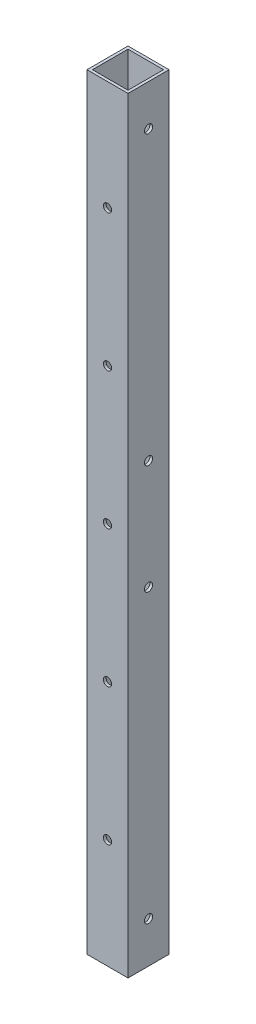
ISO-10303-21;
HEADER;
FILE_DESCRIPTION(('STEP AP214'),'2;1');
FILE_NAME('part.step','',(''),(''),'','','');
FILE_SCHEMA(('AUTOMOTIVE_DESIGN { 1 0 10303 214 1 1 1 1 }'));
ENDSEC;
DATA;
#1=APPLICATION_CONTEXT('core data for automotive mechanical design processes');
#2=APPLICATION_PROTOCOL_DEFINITION('international standard','automotive_design',2000,#1);
#3=PRODUCT_CONTEXT('',#1,'mechanical');
#4=PRODUCT('Part','Part','',(#3));
#5=PRODUCT_RELATED_PRODUCT_CATEGORY('part','',(#4));
#6=PRODUCT_DEFINITION_FORMATION('','',#4);
#7=PRODUCT_DEFINITION_CONTEXT('part definition',#1,'design');
#8=PRODUCT_DEFINITION('design','',#6,#7);
#9=PRODUCT_DEFINITION_SHAPE('','',#8);
#10=(LENGTH_UNIT() NAMED_UNIT(*) SI_UNIT(.MILLI.,.METRE.));
#11=(NAMED_UNIT(*) PLANE_ANGLE_UNIT() SI_UNIT($,.RADIAN.));
#12=(NAMED_UNIT(*) SI_UNIT($,.STERADIAN.) SOLID_ANGLE_UNIT());
#13=UNCERTAINTY_MEASURE_WITH_UNIT(LENGTH_MEASURE(1.E-05),#10,'distance_accuracy_value','');
#14=(GEOMETRIC_REPRESENTATION_CONTEXT(3) GLOBAL_UNCERTAINTY_ASSIGNED_CONTEXT((#13)) GLOBAL_UNIT_ASSIGNED_CONTEXT((#10,
#11,#12)) REPRESENTATION_CONTEXT('',''));
#15=CARTESIAN_POINT('',(0.,0.,0.));
#16=DIRECTION('',(0.,0.,1.));
#17=DIRECTION('',(1.,0.,0.));
#18=AXIS2_PLACEMENT_3D('',#15,#16,#17);
#19=CARTESIAN_POINT('',(0.,280.,0.));
#20=DIRECTION('',(0.,-1.,0.));
#21=DIRECTION('',(0.,0.,-1.));
#22=AXIS2_PLACEMENT_3D('',#19,#20,#21);
#23=PLANE('',#22);
#24=DIRECTION('',(0.,0.,-1.));
#25=VECTOR('',#24,1.);
#26=CARTESIAN_POINT('',(7.5,280.,7.5));
#27=LINE('',#26,#25);
#28=CARTESIAN_POINT('',(7.5,280.,7.5));
#29=VERTEX_POINT('',#28);
#30=CARTESIAN_POINT('',(7.5,280.,-7.5));
#31=VERTEX_POINT('',#30);
#32=EDGE_CURVE('E140',#29,#31,#27,.T.);
#33=ORIENTED_EDGE('',*,*,#32,.T.);
#34=DIRECTION('',(-1.,0.,0.));
#35=VECTOR('',#34,1.);
#36=CARTESIAN_POINT('',(-7.5,280.,-7.5));
#37=LINE('',#36,#35);
#38=CARTESIAN_POINT('',(-7.5,280.,-7.5));
#39=VERTEX_POINT('',#38);
#40=EDGE_CURVE('E143',#31,#39,#37,.T.);
#41=ORIENTED_EDGE('',*,*,#40,.T.);
#42=DIRECTION('',(0.,0.,1.));
#43=VECTOR('',#42,1.);
#44=CARTESIAN_POINT('',(-7.5,280.,7.5));
#45=LINE('',#44,#43);
#46=CARTESIAN_POINT('',(-7.5,280.,7.5));
#47=VERTEX_POINT('',#46);
#48=EDGE_CURVE('E146',#39,#47,#45,.T.);
#49=ORIENTED_EDGE('',*,*,#48,.T.);
#50=DIRECTION('',(1.,0.,0.));
#51=VECTOR('',#50,1.);
#52=CARTESIAN_POINT('',(-7.5,280.,7.5));
#53=LINE('',#52,#51);
#54=EDGE_CURVE('E148',#47,#29,#53,.T.);
#55=ORIENTED_EDGE('',*,*,#54,.T.);
#56=EDGE_LOOP('',(#33,#41,#49,#55));
#57=FACE_BOUND('',#56,.T.);
#58=DIRECTION('',(0.,0.,1.));
#59=VECTOR('',#58,1.);
#60=CARTESIAN_POINT('',(-6.5,280.,6.5));
#61=LINE('',#60,#59);
#62=CARTESIAN_POINT('',(-6.5,280.,-6.5));
#63=VERTEX_POINT('',#62);
#64=CARTESIAN_POINT('',(-6.5,280.,6.5));
#65=VERTEX_POINT('',#64);
#66=EDGE_CURVE('E102',#63,#65,#61,.T.);
#67=ORIENTED_EDGE('',*,*,#66,.F.);
#68=DIRECTION('',(-1.,0.,0.));
#69=VECTOR('',#68,1.);
#70=CARTESIAN_POINT('',(-6.5,280.,-6.5));
#71=LINE('',#70,#69);
#72=CARTESIAN_POINT('',(6.5,280.,-6.5));
#73=VERTEX_POINT('',#72);
#74=EDGE_CURVE('E124',#73,#63,#71,.T.);
#75=ORIENTED_EDGE('',*,*,#74,.F.);
#76=DIRECTION('',(0.,0.,-1.));
#77=VECTOR('',#76,1.);
#78=CARTESIAN_POINT('',(6.5,280.,6.5));
#79=LINE('',#78,#77);
#80=CARTESIAN_POINT('',(6.5,280.,6.5));
#81=VERTEX_POINT('',#80);
#82=EDGE_CURVE('E122',#81,#73,#79,.T.);
#83=ORIENTED_EDGE('',*,*,#82,.F.);
#84=DIRECTION('',(1.,0.,0.));
#85=VECTOR('',#84,1.);
#86=CARTESIAN_POINT('',(-6.5,280.,6.5));
#87=LINE('',#86,#85);
#88=EDGE_CURVE('E110',#65,#81,#87,.T.);
#89=ORIENTED_EDGE('',*,*,#88,.F.);
#90=EDGE_LOOP('',(#67,#75,#83,#89));
#91=FACE_BOUND('',#90,.T.);
#92=ADVANCED_FACE('F35',(#57,#91),#23,.F.);
#93=CARTESIAN_POINT('',(0.,0.,0.));
#94=DIRECTION('',(0.,-1.,0.));
#95=DIRECTION('',(0.,0.,-1.));
#96=AXIS2_PLACEMENT_3D('',#93,#94,#95);
#97=PLANE('',#96);
#98=DIRECTION('',(0.,0.,-1.));
#99=VECTOR('',#98,1.);
#100=CARTESIAN_POINT('',(7.5,0.,7.5));
#101=LINE('',#100,#99);
#102=CARTESIAN_POINT('',(7.5,0.,7.5));
#103=VERTEX_POINT('',#102);
#104=CARTESIAN_POINT('',(7.5,0.,-7.5));
#105=VERTEX_POINT('',#104);
#106=EDGE_CURVE('E118',#103,#105,#101,.T.);
#107=ORIENTED_EDGE('',*,*,#106,.F.);
#108=DIRECTION('',(1.,0.,0.));
#109=VECTOR('',#108,1.);
#110=CARTESIAN_POINT('',(-7.5,0.,7.5));
#111=LINE('',#110,#109);
#112=CARTESIAN_POINT('',(-7.5,0.,7.5));
#113=VERTEX_POINT('',#112);
#114=EDGE_CURVE('E144',#113,#103,#111,.T.);
#115=ORIENTED_EDGE('',*,*,#114,.F.);
#116=DIRECTION('',(0.,0.,1.));
#117=VECTOR('',#116,1.);
#118=CARTESIAN_POINT('',(-7.5,0.,7.5));
#119=LINE('',#118,#117);
#120=CARTESIAN_POINT('',(-7.5,0.,-7.5));
#121=VERTEX_POINT('',#120);
#122=EDGE_CURVE('E155',#121,#113,#119,.T.);
#123=ORIENTED_EDGE('',*,*,#122,.F.);
#124=DIRECTION('',(-1.,0.,0.));
#125=VECTOR('',#124,1.);
#126=CARTESIAN_POINT('',(-7.5,0.,-7.5));
#127=LINE('',#126,#125);
#128=EDGE_CURVE('E153',#105,#121,#127,.T.);
#129=ORIENTED_EDGE('',*,*,#128,.F.);
#130=EDGE_LOOP('',(#107,#115,#123,#129));
#131=FACE_BOUND('',#130,.T.);
#132=DIRECTION('',(-1.,0.,0.));
#133=VECTOR('',#132,1.);
#134=CARTESIAN_POINT('',(-6.5,0.,-6.5));
#135=LINE('',#134,#133);
#136=CARTESIAN_POINT('',(6.5,0.,-6.5));
#137=VERTEX_POINT('',#136);
#138=CARTESIAN_POINT('',(-6.5,0.,-6.5));
#139=VERTEX_POINT('',#138);
#140=EDGE_CURVE('E111',#137,#139,#135,.T.);
#141=ORIENTED_EDGE('',*,*,#140,.T.);
#142=DIRECTION('',(0.,0.,1.));
#143=VECTOR('',#142,1.);
#144=CARTESIAN_POINT('',(-6.5,0.,6.5));
#145=LINE('',#144,#143);
#146=CARTESIAN_POINT('',(-6.5,0.,6.5));
#147=VERTEX_POINT('',#146);
#148=EDGE_CURVE('E60',#139,#147,#145,.T.);
#149=ORIENTED_EDGE('',*,*,#148,.T.);
#150=DIRECTION('',(1.,0.,0.));
#151=VECTOR('',#150,1.);
#152=CARTESIAN_POINT('',(-6.5,0.,6.5));
#153=LINE('',#152,#151);
#154=CARTESIAN_POINT('',(6.5,0.,6.5));
#155=VERTEX_POINT('',#154);
#156=EDGE_CURVE('E117',#147,#155,#153,.T.);
#157=ORIENTED_EDGE('',*,*,#156,.T.);
#158=DIRECTION('',(0.,0.,-1.));
#159=VECTOR('',#158,1.);
#160=CARTESIAN_POINT('',(6.5,0.,6.5));
#161=LINE('',#160,#159);
#162=EDGE_CURVE('E132',#155,#137,#161,.T.);
#163=ORIENTED_EDGE('',*,*,#162,.T.);
#164=EDGE_LOOP('',(#141,#149,#157,#163));
#165=FACE_BOUND('',#164,.T.);
#166=ADVANCED_FACE('F278',(#131,#165),#97,.T.);
#167=CARTESIAN_POINT('',(7.5,280.,7.5));
#168=DIRECTION('',(-1.,0.,0.));
#169=DIRECTION('',(0.,0.,1.));
#170=AXIS2_PLACEMENT_3D('',#167,#168,#169);
#171=PLANE('',#170);
#172=CARTESIAN_POINT('',(7.5,265.,0.));
#173=DIRECTION('',(1.,0.,0.));
#174=DIRECTION('',(0.,0.,1.));
#175=AXIS2_PLACEMENT_3D('',#172,#173,#174);
#176=CIRCLE('',#175,1.5);
#177=CARTESIAN_POINT('',(7.5,265.,1.49999999999997));
#178=VERTEX_POINT('',#177);
#179=EDGE_CURVE('E400',#178,#178,#176,.T.);
#180=ORIENTED_EDGE('',*,*,#179,.F.);
#181=EDGE_LOOP('',(#180));
#182=FACE_BOUND('',#181,.T.);
#183=CARTESIAN_POINT('',(7.5,15.,0.));
#184=DIRECTION('',(1.,0.,0.));
#185=DIRECTION('',(0.,0.,-1.));
#186=AXIS2_PLACEMENT_3D('',#183,#184,#185);
#187=CIRCLE('',#186,1.5);
#188=CARTESIAN_POINT('',(7.5,15.,-1.50000000000003));
#189=VERTEX_POINT('',#188);
#190=EDGE_CURVE('E391',#189,#189,#187,.T.);
#191=ORIENTED_EDGE('',*,*,#190,.F.);
#192=EDGE_LOOP('',(#191));
#193=FACE_BOUND('',#192,.T.);
#194=CARTESIAN_POINT('',(7.5,120.,0.));
#195=DIRECTION('',(1.,0.,0.));
#196=DIRECTION('',(0.,0.,1.));
#197=AXIS2_PLACEMENT_3D('',#194,#195,#196);
#198=CIRCLE('',#197,1.5);
#199=CARTESIAN_POINT('',(7.5,120.,1.49999999999999));
#200=VERTEX_POINT('',#199);
#201=EDGE_CURVE('E207',#200,#200,#198,.T.);
#202=ORIENTED_EDGE('',*,*,#201,.F.);
#203=EDGE_LOOP('',(#202));
#204=FACE_BOUND('',#203,.T.);
#205=CARTESIAN_POINT('',(7.5,160.,0.));
#206=DIRECTION('',(1.,0.,0.));
#207=DIRECTION('',(0.,0.,-1.));
#208=AXIS2_PLACEMENT_3D('',#205,#206,#207);
#209=CIRCLE('',#208,1.5);
#210=CARTESIAN_POINT('',(7.5,160.,-1.50000000000002));
#211=VERTEX_POINT('',#210);
#212=EDGE_CURVE('E213',#211,#211,#209,.T.);
#213=ORIENTED_EDGE('',*,*,#212,.F.);
#214=EDGE_LOOP('',(#213));
#215=FACE_BOUND('',#214,.T.);
#216=ORIENTED_EDGE('',*,*,#106,.T.);
#217=DIRECTION('',(0.,-1.,0.));
#218=VECTOR('',#217,1.);
#219=CARTESIAN_POINT('',(7.5,280.,-7.5));
#220=LINE('',#219,#218);
#221=EDGE_CURVE('E11',#31,#105,#220,.T.);
#222=ORIENTED_EDGE('',*,*,#221,.F.);
#223=ORIENTED_EDGE('',*,*,#32,.F.);
#224=DIRECTION('',(0.,-1.,0.));
#225=VECTOR('',#224,1.);
#226=CARTESIAN_POINT('',(7.5,280.,7.5));
#227=LINE('',#226,#225);
#228=EDGE_CURVE('E150',#29,#103,#227,.T.);
#229=ORIENTED_EDGE('',*,*,#228,.T.);
#230=EDGE_LOOP('',(#216,#222,#223,#229));
#231=FACE_BOUND('',#230,.T.);
#232=ADVANCED_FACE('F37',(#182,#193,#204,#215,#231),#171,.F.);
#233=CARTESIAN_POINT('',(-7.5,280.,-7.5));
#234=DIRECTION('',(0.,0.,1.));
#235=DIRECTION('',(1.,0.,0.));
#236=AXIS2_PLACEMENT_3D('',#233,#234,#235);
#237=PLANE('',#236);
#238=CARTESIAN_POINT('',(0.,140.,-7.5));
#239=DIRECTION('',(0.,0.,1.));
#240=DIRECTION('',(1.,0.,0.));
#241=AXIS2_PLACEMENT_3D('',#238,#239,#240);
#242=CIRCLE('',#241,1.5);
#243=CARTESIAN_POINT('',(1.5,140.,-7.5));
#244=VERTEX_POINT('',#243);
#245=EDGE_CURVE('E173',#244,#244,#242,.T.);
#246=ORIENTED_EDGE('',*,*,#245,.T.);
#247=EDGE_LOOP('',(#246));
#248=FACE_BOUND('',#247,.T.);
#249=CARTESIAN_POINT('',(0.,90.,-7.5));
#250=DIRECTION('',(0.,0.,1.));
#251=DIRECTION('',(1.,0.,0.));
#252=AXIS2_PLACEMENT_3D('',#249,#250,#251);
#253=CIRCLE('',#252,1.5);
#254=CARTESIAN_POINT('',(1.5,90.,-7.5));
#255=VERTEX_POINT('',#254);
#256=EDGE_CURVE('E226',#255,#255,#253,.T.);
#257=ORIENTED_EDGE('',*,*,#256,.T.);
#258=EDGE_LOOP('',(#257));
#259=FACE_BOUND('',#258,.T.);
#260=CARTESIAN_POINT('',(0.,240.,-7.5));
#261=DIRECTION('',(0.,0.,1.));
#262=DIRECTION('',(-1.,0.,0.));
#263=AXIS2_PLACEMENT_3D('',#260,#261,#262);
#264=CIRCLE('',#263,1.5);
#265=CARTESIAN_POINT('',(-1.5,240.,-7.5));
#266=VERTEX_POINT('',#265);
#267=EDGE_CURVE('E232',#266,#266,#264,.T.);
#268=ORIENTED_EDGE('',*,*,#267,.T.);
#269=EDGE_LOOP('',(#268));
#270=FACE_BOUND('',#269,.T.);
#271=CARTESIAN_POINT('',(0.,190.,-7.5));
#272=DIRECTION('',(0.,0.,1.));
#273=DIRECTION('',(-1.,0.,0.));
#274=AXIS2_PLACEMENT_3D('',#271,#272,#273);
#275=CIRCLE('',#274,1.5);
#276=CARTESIAN_POINT('',(-1.5,190.,-7.5));
#277=VERTEX_POINT('',#276);
#278=EDGE_CURVE('E238',#277,#277,#275,.T.);
#279=ORIENTED_EDGE('',*,*,#278,.T.);
#280=EDGE_LOOP('',(#279));
#281=FACE_BOUND('',#280,.T.);
#282=CARTESIAN_POINT('',(0.,40.,-7.5));
#283=DIRECTION('',(0.,0.,1.));
#284=DIRECTION('',(1.,0.,0.));
#285=AXIS2_PLACEMENT_3D('',#282,#283,#284);
#286=CIRCLE('',#285,1.5);
#287=CARTESIAN_POINT('',(1.5,40.,-7.5));
#288=VERTEX_POINT('',#287);
#289=EDGE_CURVE('E168',#288,#288,#286,.T.);
#290=ORIENTED_EDGE('',*,*,#289,.T.);
#291=EDGE_LOOP('',(#290));
#292=FACE_BOUND('',#291,.T.);
#293=ORIENTED_EDGE('',*,*,#128,.T.);
#294=DIRECTION('',(0.,-1.,0.));
#295=VECTOR('',#294,1.);
#296=CARTESIAN_POINT('',(-7.5,280.,-7.5));
#297=LINE('',#296,#295);
#298=EDGE_CURVE('E44',#39,#121,#297,.T.);
#299=ORIENTED_EDGE('',*,*,#298,.F.);
#300=ORIENTED_EDGE('',*,*,#40,.F.);
#301=ORIENTED_EDGE('',*,*,#221,.T.);
#302=EDGE_LOOP('',(#293,#299,#300,#301));
#303=FACE_BOUND('',#302,.T.);
#304=ADVANCED_FACE('F292',(#248,#259,#270,#281,#292,#303),#237,.F.);
#305=CARTESIAN_POINT('',(-7.5,280.,7.5));
#306=DIRECTION('',(1.,0.,0.));
#307=DIRECTION('',(0.,0.,-1.));
#308=AXIS2_PLACEMENT_3D('',#305,#306,#307);
#309=PLANE('',#308);
#310=CARTESIAN_POINT('',(-7.5,265.,0.));
#311=DIRECTION('',(1.,0.,0.));
#312=DIRECTION('',(0.,0.,1.));
#313=AXIS2_PLACEMENT_3D('',#310,#311,#312);
#314=CIRCLE('',#313,1.5);
#315=CARTESIAN_POINT('',(-7.5,265.,1.49999999999997));
#316=VERTEX_POINT('',#315);
#317=EDGE_CURVE('E395',#316,#316,#314,.T.);
#318=ORIENTED_EDGE('',*,*,#317,.T.);
#319=EDGE_LOOP('',(#318));
#320=FACE_BOUND('',#319,.T.);
#321=CARTESIAN_POINT('',(-7.5,15.,0.));
#322=DIRECTION('',(1.,0.,0.));
#323=DIRECTION('',(0.,0.,-1.));
#324=AXIS2_PLACEMENT_3D('',#321,#322,#323);
#325=CIRCLE('',#324,1.5);
#326=CARTESIAN_POINT('',(-7.5,15.,-1.50000000000003));
#327=VERTEX_POINT('',#326);
#328=EDGE_CURVE('E389',#327,#327,#325,.T.);
#329=ORIENTED_EDGE('',*,*,#328,.T.);
#330=EDGE_LOOP('',(#329));
#331=FACE_BOUND('',#330,.T.);
#332=CARTESIAN_POINT('',(-7.5,120.,0.));
#333=DIRECTION('',(1.,0.,0.));
#334=DIRECTION('',(0.,0.,1.));
#335=AXIS2_PLACEMENT_3D('',#332,#333,#334);
#336=CIRCLE('',#335,1.5);
#337=CARTESIAN_POINT('',(-7.5,120.,1.49999999999999));
#338=VERTEX_POINT('',#337);
#339=EDGE_CURVE('E194',#338,#338,#336,.T.);
#340=ORIENTED_EDGE('',*,*,#339,.T.);
#341=EDGE_LOOP('',(#340));
#342=FACE_BOUND('',#341,.T.);
#343=CARTESIAN_POINT('',(-7.5,160.,0.));
#344=DIRECTION('',(1.,0.,0.));
#345=DIRECTION('',(0.,0.,-1.));
#346=AXIS2_PLACEMENT_3D('',#343,#344,#345);
#347=CIRCLE('',#346,1.5);
#348=CARTESIAN_POINT('',(-7.5,160.,-1.50000000000002));
#349=VERTEX_POINT('',#348);
#350=EDGE_CURVE('E190',#349,#349,#347,.T.);
#351=ORIENTED_EDGE('',*,*,#350,.T.);
#352=EDGE_LOOP('',(#351));
#353=FACE_BOUND('',#352,.T.);
#354=ORIENTED_EDGE('',*,*,#122,.T.);
#355=DIRECTION('',(0.,-1.,0.));
#356=VECTOR('',#355,1.);
#357=CARTESIAN_POINT('',(-7.5,280.,7.5));
#358=LINE('',#357,#356);
#359=EDGE_CURVE('E160',#47,#113,#358,.T.);
#360=ORIENTED_EDGE('',*,*,#359,.F.);
#361=ORIENTED_EDGE('',*,*,#48,.F.);
#362=ORIENTED_EDGE('',*,*,#298,.T.);
#363=EDGE_LOOP('',(#354,#360,#361,#362));
#364=FACE_BOUND('',#363,.T.);
#365=ADVANCED_FACE('F289',(#320,#331,#342,#353,#364),#309,.F.);
#366=CARTESIAN_POINT('',(-7.5,280.,7.5));
#367=DIRECTION('',(0.,0.,-1.));
#368=DIRECTION('',(-1.,0.,0.));
#369=AXIS2_PLACEMENT_3D('',#366,#367,#368);
#370=PLANE('',#369);
#371=CARTESIAN_POINT('',(0.,140.,7.5));
#372=DIRECTION('',(0.,0.,1.));
#373=DIRECTION('',(1.,0.,0.));
#374=AXIS2_PLACEMENT_3D('',#371,#372,#373);
#375=CIRCLE('',#374,1.5);
#376=CARTESIAN_POINT('',(1.5,140.,7.5));
#377=VERTEX_POINT('',#376);
#378=EDGE_CURVE('E223',#377,#377,#375,.T.);
#379=ORIENTED_EDGE('',*,*,#378,.F.);
#380=EDGE_LOOP('',(#379));
#381=FACE_BOUND('',#380,.T.);
#382=CARTESIAN_POINT('',(0.,90.,7.5));
#383=DIRECTION('',(0.,0.,1.));
#384=DIRECTION('',(1.,0.,0.));
#385=AXIS2_PLACEMENT_3D('',#382,#383,#384);
#386=CIRCLE('',#385,1.5);
#387=CARTESIAN_POINT('',(1.5,90.,7.5));
#388=VERTEX_POINT('',#387);
#389=EDGE_CURVE('E229',#388,#388,#386,.T.);
#390=ORIENTED_EDGE('',*,*,#389,.F.);
#391=EDGE_LOOP('',(#390));
#392=FACE_BOUND('',#391,.T.);
#393=CARTESIAN_POINT('',(0.,240.,7.5));
#394=DIRECTION('',(0.,0.,1.));
#395=DIRECTION('',(-1.,0.,0.));
#396=AXIS2_PLACEMENT_3D('',#393,#394,#395);
#397=CIRCLE('',#396,1.5);
#398=CARTESIAN_POINT('',(-1.5,240.,7.5));
#399=VERTEX_POINT('',#398);
#400=EDGE_CURVE('E235',#399,#399,#397,.T.);
#401=ORIENTED_EDGE('',*,*,#400,.F.);
#402=EDGE_LOOP('',(#401));
#403=FACE_BOUND('',#402,.T.);
#404=CARTESIAN_POINT('',(0.,190.,7.5));
#405=DIRECTION('',(0.,0.,1.));
#406=DIRECTION('',(-1.,0.,0.));
#407=AXIS2_PLACEMENT_3D('',#404,#405,#406);
#408=CIRCLE('',#407,1.5);
#409=CARTESIAN_POINT('',(-1.5,190.,7.5));
#410=VERTEX_POINT('',#409);
#411=EDGE_CURVE('E220',#410,#410,#408,.T.);
#412=ORIENTED_EDGE('',*,*,#411,.F.);
#413=EDGE_LOOP('',(#412));
#414=FACE_BOUND('',#413,.T.);
#415=CARTESIAN_POINT('',(0.,40.,7.5));
#416=DIRECTION('',(0.,0.,1.));
#417=DIRECTION('',(1.,0.,0.));
#418=AXIS2_PLACEMENT_3D('',#415,#416,#417);
#419=CIRCLE('',#418,1.5);
#420=CARTESIAN_POINT('',(1.5,40.,7.5));
#421=VERTEX_POINT('',#420);
#422=EDGE_CURVE('E251',#421,#421,#419,.T.);
#423=ORIENTED_EDGE('',*,*,#422,.F.);
#424=EDGE_LOOP('',(#423));
#425=FACE_BOUND('',#424,.T.);
#426=ORIENTED_EDGE('',*,*,#114,.T.);
#427=ORIENTED_EDGE('',*,*,#228,.F.);
#428=ORIENTED_EDGE('',*,*,#54,.F.);
#429=ORIENTED_EDGE('',*,*,#359,.T.);
#430=EDGE_LOOP('',(#426,#427,#428,#429));
#431=FACE_BOUND('',#430,.T.);
#432=ADVANCED_FACE('F272',(#381,#392,#403,#414,#425,#431),#370,.F.);
#433=CARTESIAN_POINT('',(-6.5,280.,6.5));
#434=DIRECTION('',(1.,0.,0.));
#435=DIRECTION('',(0.,0.,-1.));
#436=AXIS2_PLACEMENT_3D('',#433,#434,#435);
#437=PLANE('',#436);
#438=CARTESIAN_POINT('',(-6.5,265.,0.));
#439=DIRECTION('',(1.,0.,0.));
#440=DIRECTION('',(0.,0.,-1.));
#441=AXIS2_PLACEMENT_3D('',#438,#439,#440);
#442=CIRCLE('',#441,1.5);
#443=CARTESIAN_POINT('',(-6.5,265.,-1.50000000000003));
#444=VERTEX_POINT('',#443);
#445=EDGE_CURVE('E210',#444,#444,#442,.T.);
#446=ORIENTED_EDGE('',*,*,#445,.F.);
#447=EDGE_LOOP('',(#446));
#448=FACE_BOUND('',#447,.T.);
#449=CARTESIAN_POINT('',(-6.5,15.,0.));
#450=DIRECTION('',(1.,0.,0.));
#451=DIRECTION('',(0.,0.,-1.));
#452=AXIS2_PLACEMENT_3D('',#449,#450,#451);
#453=CIRCLE('',#452,1.5);
#454=CARTESIAN_POINT('',(-6.5,15.,-1.50000000000003));
#455=VERTEX_POINT('',#454);
#456=EDGE_CURVE('E197',#455,#455,#453,.T.);
#457=ORIENTED_EDGE('',*,*,#456,.F.);
#458=EDGE_LOOP('',(#457));
#459=FACE_BOUND('',#458,.T.);
#460=CARTESIAN_POINT('',(-6.5,120.,0.));
#461=DIRECTION('',(1.,0.,0.));
#462=DIRECTION('',(0.,0.,-1.));
#463=AXIS2_PLACEMENT_3D('',#460,#461,#462);
#464=CIRCLE('',#463,1.5);
#465=CARTESIAN_POINT('',(-6.5,120.,-1.50000000000002));
#466=VERTEX_POINT('',#465);
#467=EDGE_CURVE('E193',#466,#466,#464,.T.);
#468=ORIENTED_EDGE('',*,*,#467,.F.);
#469=EDGE_LOOP('',(#468));
#470=FACE_BOUND('',#469,.T.);
#471=CARTESIAN_POINT('',(-6.5,160.,0.));
#472=DIRECTION('',(1.,0.,0.));
#473=DIRECTION('',(0.,0.,-1.));
#474=AXIS2_PLACEMENT_3D('',#471,#472,#473);
#475=CIRCLE('',#474,1.5);
#476=CARTESIAN_POINT('',(-6.5,160.,-1.50000000000002));
#477=VERTEX_POINT('',#476);
#478=EDGE_CURVE('E189',#477,#477,#475,.T.);
#479=ORIENTED_EDGE('',*,*,#478,.F.);
#480=EDGE_LOOP('',(#479));
#481=FACE_BOUND('',#480,.T.);
#482=ORIENTED_EDGE('',*,*,#148,.F.);
#483=DIRECTION('',(0.,-1.,0.));
#484=VECTOR('',#483,1.);
#485=CARTESIAN_POINT('',(-6.5,280.,-6.5));
#486=LINE('',#485,#484);
#487=EDGE_CURVE('E106',#63,#139,#486,.T.);
#488=ORIENTED_EDGE('',*,*,#487,.F.);
#489=ORIENTED_EDGE('',*,*,#66,.T.);
#490=DIRECTION('',(0.,-1.,0.));
#491=VECTOR('',#490,1.);
#492=CARTESIAN_POINT('',(-6.5,280.,6.5));
#493=LINE('',#492,#491);
#494=EDGE_CURVE('E105',#65,#147,#493,.T.);
#495=ORIENTED_EDGE('',*,*,#494,.T.);
#496=EDGE_LOOP('',(#482,#488,#489,#495));
#497=FACE_BOUND('',#496,.T.);
#498=ADVANCED_FACE('F104',(#448,#459,#470,#481,#497),#437,.T.);
#499=CARTESIAN_POINT('',(-6.5,280.,6.5));
#500=DIRECTION('',(0.,0.,-1.));
#501=DIRECTION('',(-1.,0.,0.));
#502=AXIS2_PLACEMENT_3D('',#499,#500,#501);
#503=PLANE('',#502);
#504=CARTESIAN_POINT('',(0.,140.,6.5));
#505=DIRECTION('',(0.,0.,-1.));
#506=DIRECTION('',(-1.,0.,0.));
#507=AXIS2_PLACEMENT_3D('',#504,#505,#506);
#508=CIRCLE('',#507,1.5);
#509=CARTESIAN_POINT('',(-1.5,140.,6.5));
#510=VERTEX_POINT('',#509);
#511=EDGE_CURVE('E185',#510,#510,#508,.T.);
#512=ORIENTED_EDGE('',*,*,#511,.F.);
#513=EDGE_LOOP('',(#512));
#514=FACE_BOUND('',#513,.T.);
#515=CARTESIAN_POINT('',(0.,90.,6.5));
#516=DIRECTION('',(0.,0.,-1.));
#517=DIRECTION('',(-1.,0.,0.));
#518=AXIS2_PLACEMENT_3D('',#515,#516,#517);
#519=CIRCLE('',#518,1.5);
#520=CARTESIAN_POINT('',(-1.5,90.,6.5));
#521=VERTEX_POINT('',#520);
#522=EDGE_CURVE('E181',#521,#521,#519,.T.);
#523=ORIENTED_EDGE('',*,*,#522,.F.);
#524=EDGE_LOOP('',(#523));
#525=FACE_BOUND('',#524,.T.);
#526=CARTESIAN_POINT('',(0.,240.,6.5));
#527=DIRECTION('',(0.,0.,-1.));
#528=DIRECTION('',(-1.,0.,0.));
#529=AXIS2_PLACEMENT_3D('',#526,#527,#528);
#530=CIRCLE('',#529,1.5);
#531=CARTESIAN_POINT('',(-1.5,240.,6.5));
#532=VERTEX_POINT('',#531);
#533=EDGE_CURVE('E177',#532,#532,#530,.T.);
#534=ORIENTED_EDGE('',*,*,#533,.F.);
#535=EDGE_LOOP('',(#534));
#536=FACE_BOUND('',#535,.T.);
#537=CARTESIAN_POINT('',(0.,190.,6.5));
#538=DIRECTION('',(0.,0.,-1.));
#539=DIRECTION('',(-1.,0.,0.));
#540=AXIS2_PLACEMENT_3D('',#537,#538,#539);
#541=CIRCLE('',#540,1.5);
#542=CARTESIAN_POINT('',(-1.5,190.,6.5));
#543=VERTEX_POINT('',#542);
#544=EDGE_CURVE('E172',#543,#543,#541,.T.);
#545=ORIENTED_EDGE('',*,*,#544,.F.);
#546=EDGE_LOOP('',(#545));
#547=FACE_BOUND('',#546,.T.);
#548=CARTESIAN_POINT('',(0.,40.,6.5));
#549=DIRECTION('',(0.,0.,-1.));
#550=DIRECTION('',(-1.,0.,0.));
#551=AXIS2_PLACEMENT_3D('',#548,#549,#550);
#552=CIRCLE('',#551,1.5);
#553=CARTESIAN_POINT('',(-1.5,40.,6.5));
#554=VERTEX_POINT('',#553);
#555=EDGE_CURVE('E130',#554,#554,#552,.T.);
#556=ORIENTED_EDGE('',*,*,#555,.F.);
#557=EDGE_LOOP('',(#556));
#558=FACE_BOUND('',#557,.T.);
#559=ORIENTED_EDGE('',*,*,#156,.F.);
#560=ORIENTED_EDGE('',*,*,#494,.F.);
#561=ORIENTED_EDGE('',*,*,#88,.T.);
#562=DIRECTION('',(0.,-1.,0.));
#563=VECTOR('',#562,1.);
#564=CARTESIAN_POINT('',(6.5,280.,6.5));
#565=LINE('',#564,#563);
#566=EDGE_CURVE('E119',#81,#155,#565,.T.);
#567=ORIENTED_EDGE('',*,*,#566,.T.);
#568=EDGE_LOOP('',(#559,#560,#561,#567));
#569=FACE_BOUND('',#568,.T.);
#570=ADVANCED_FACE('F114',(#514,#525,#536,#547,#558,#569),#503,.T.);
#571=CARTESIAN_POINT('',(6.5,280.,6.5));
#572=DIRECTION('',(-1.,0.,0.));
#573=DIRECTION('',(0.,0.,1.));
#574=AXIS2_PLACEMENT_3D('',#571,#572,#573);
#575=PLANE('',#574);
#576=CARTESIAN_POINT('',(6.5,265.,0.));
#577=DIRECTION('',(-1.,0.,0.));
#578=DIRECTION('',(0.,0.,1.));
#579=AXIS2_PLACEMENT_3D('',#576,#577,#578);
#580=CIRCLE('',#579,1.5);
#581=CARTESIAN_POINT('',(6.5,265.,1.49999999999997));
#582=VERTEX_POINT('',#581);
#583=EDGE_CURVE('E39',#582,#582,#580,.T.);
#584=ORIENTED_EDGE('',*,*,#583,.F.);
#585=EDGE_LOOP('',(#584));
#586=FACE_BOUND('',#585,.T.);
#587=CARTESIAN_POINT('',(6.5,15.,0.));
#588=DIRECTION('',(-1.,0.,0.));
#589=DIRECTION('',(0.,0.,1.));
#590=AXIS2_PLACEMENT_3D('',#587,#588,#589);
#591=CIRCLE('',#590,1.5);
#592=CARTESIAN_POINT('',(6.5,15.,1.49999999999997));
#593=VERTEX_POINT('',#592);
#594=EDGE_CURVE('E195',#593,#593,#591,.T.);
#595=ORIENTED_EDGE('',*,*,#594,.F.);
#596=EDGE_LOOP('',(#595));
#597=FACE_BOUND('',#596,.T.);
#598=CARTESIAN_POINT('',(6.5,120.,0.));
#599=DIRECTION('',(-1.,0.,0.));
#600=DIRECTION('',(0.,0.,1.));
#601=AXIS2_PLACEMENT_3D('',#598,#599,#600);
#602=CIRCLE('',#601,1.5);
#603=CARTESIAN_POINT('',(6.5,120.,1.49999999999999));
#604=VERTEX_POINT('',#603);
#605=EDGE_CURVE('E191',#604,#604,#602,.T.);
#606=ORIENTED_EDGE('',*,*,#605,.F.);
#607=EDGE_LOOP('',(#606));
#608=FACE_BOUND('',#607,.T.);
#609=CARTESIAN_POINT('',(6.5,160.,0.));
#610=DIRECTION('',(-1.,0.,0.));
#611=DIRECTION('',(0.,0.,1.));
#612=AXIS2_PLACEMENT_3D('',#609,#610,#611);
#613=CIRCLE('',#612,1.5);
#614=CARTESIAN_POINT('',(6.5,160.,1.49999999999999));
#615=VERTEX_POINT('',#614);
#616=EDGE_CURVE('E186',#615,#615,#613,.T.);
#617=ORIENTED_EDGE('',*,*,#616,.F.);
#618=EDGE_LOOP('',(#617));
#619=FACE_BOUND('',#618,.T.);
#620=ORIENTED_EDGE('',*,*,#162,.F.);
#621=ORIENTED_EDGE('',*,*,#566,.F.);
#622=ORIENTED_EDGE('',*,*,#82,.T.);
#623=DIRECTION('',(0.,-1.,0.));
#624=VECTOR('',#623,1.);
#625=CARTESIAN_POINT('',(6.5,280.,-6.5));
#626=LINE('',#625,#624);
#627=EDGE_CURVE('E52',#73,#137,#626,.T.);
#628=ORIENTED_EDGE('',*,*,#627,.T.);
#629=EDGE_LOOP('',(#620,#621,#622,#628));
#630=FACE_BOUND('',#629,.T.);
#631=ADVANCED_FACE('F262',(#586,#597,#608,#619,#630),#575,.T.);
#632=CARTESIAN_POINT('',(-6.5,280.,-6.5));
#633=DIRECTION('',(0.,0.,1.));
#634=DIRECTION('',(1.,0.,0.));
#635=AXIS2_PLACEMENT_3D('',#632,#633,#634);
#636=PLANE('',#635);
#637=CARTESIAN_POINT('',(0.,140.,-6.5));
#638=DIRECTION('',(0.,0.,1.));
#639=DIRECTION('',(1.,0.,0.));
#640=AXIS2_PLACEMENT_3D('',#637,#638,#639);
#641=CIRCLE('',#640,1.5);
#642=CARTESIAN_POINT('',(1.5,140.,-6.5));
#643=VERTEX_POINT('',#642);
#644=EDGE_CURVE('E182',#643,#643,#641,.T.);
#645=ORIENTED_EDGE('',*,*,#644,.F.);
#646=EDGE_LOOP('',(#645));
#647=FACE_BOUND('',#646,.T.);
#648=CARTESIAN_POINT('',(0.,90.,-6.5));
#649=DIRECTION('',(0.,0.,1.));
#650=DIRECTION('',(1.,0.,0.));
#651=AXIS2_PLACEMENT_3D('',#648,#649,#650);
#652=CIRCLE('',#651,1.5);
#653=CARTESIAN_POINT('',(1.5,90.,-6.5));
#654=VERTEX_POINT('',#653);
#655=EDGE_CURVE('E178',#654,#654,#652,.T.);
#656=ORIENTED_EDGE('',*,*,#655,.F.);
#657=EDGE_LOOP('',(#656));
#658=FACE_BOUND('',#657,.T.);
#659=CARTESIAN_POINT('',(0.,240.,-6.5));
#660=DIRECTION('',(0.,0.,1.));
#661=DIRECTION('',(1.,0.,0.));
#662=AXIS2_PLACEMENT_3D('',#659,#660,#661);
#663=CIRCLE('',#662,1.5);
#664=CARTESIAN_POINT('',(1.5,240.,-6.5));
#665=VERTEX_POINT('',#664);
#666=EDGE_CURVE('E174',#665,#665,#663,.T.);
#667=ORIENTED_EDGE('',*,*,#666,.F.);
#668=EDGE_LOOP('',(#667));
#669=FACE_BOUND('',#668,.T.);
#670=CARTESIAN_POINT('',(0.,190.,-6.5));
#671=DIRECTION('',(0.,0.,1.));
#672=DIRECTION('',(1.,0.,0.));
#673=AXIS2_PLACEMENT_3D('',#670,#671,#672);
#674=CIRCLE('',#673,1.5);
#675=CARTESIAN_POINT('',(1.5,190.,-6.5));
#676=VERTEX_POINT('',#675);
#677=EDGE_CURVE('E169',#676,#676,#674,.T.);
#678=ORIENTED_EDGE('',*,*,#677,.F.);
#679=EDGE_LOOP('',(#678));
#680=FACE_BOUND('',#679,.T.);
#681=CARTESIAN_POINT('',(0.,40.,-6.5));
#682=DIRECTION('',(0.,0.,1.));
#683=DIRECTION('',(1.,0.,0.));
#684=AXIS2_PLACEMENT_3D('',#681,#682,#683);
#685=CIRCLE('',#684,1.5);
#686=CARTESIAN_POINT('',(1.5,40.,-6.5));
#687=VERTEX_POINT('',#686);
#688=EDGE_CURVE('E165',#687,#687,#685,.T.);
#689=ORIENTED_EDGE('',*,*,#688,.F.);
#690=EDGE_LOOP('',(#689));
#691=FACE_BOUND('',#690,.T.);
#692=ORIENTED_EDGE('',*,*,#140,.F.);
#693=ORIENTED_EDGE('',*,*,#627,.F.);
#694=ORIENTED_EDGE('',*,*,#74,.T.);
#695=ORIENTED_EDGE('',*,*,#487,.T.);
#696=EDGE_LOOP('',(#692,#693,#694,#695));
#697=FACE_BOUND('',#696,.T.);
#698=ADVANCED_FACE('F269',(#647,#658,#669,#680,#691,#697),#636,.T.);
#699=CARTESIAN_POINT('',(0.,40.,-7.5));
#700=DIRECTION('',(0.,0.,1.));
#701=DIRECTION('',(1.,0.,0.));
#702=AXIS2_PLACEMENT_3D('',#699,#700,#701);
#703=CYLINDRICAL_SURFACE('',#702,1.5);
#704=ORIENTED_EDGE('',*,*,#688,.T.);
#705=EDGE_LOOP('',(#704));
#706=FACE_BOUND('',#705,.T.);
#707=ORIENTED_EDGE('',*,*,#289,.F.);
#708=EDGE_LOOP('',(#707));
#709=FACE_BOUND('',#708,.T.);
#710=ADVANCED_FACE('F326',(#706,#709),#703,.F.);
#711=ORIENTED_EDGE('',*,*,#555,.T.);
#712=EDGE_LOOP('',(#711));
#713=FACE_BOUND('',#712,.T.);
#714=ORIENTED_EDGE('',*,*,#422,.T.);
#715=EDGE_LOOP('',(#714));
#716=FACE_BOUND('',#715,.T.);
#717=ADVANCED_FACE('F258',(#713,#716),#703,.F.);
#718=CARTESIAN_POINT('',(0.,190.,-7.5));
#719=DIRECTION('',(0.,0.,1.));
#720=DIRECTION('',(1.,0.,0.));
#721=AXIS2_PLACEMENT_3D('',#718,#719,#720);
#722=CYLINDRICAL_SURFACE('',#721,1.5);
#723=ORIENTED_EDGE('',*,*,#677,.T.);
#724=EDGE_LOOP('',(#723));
#725=FACE_BOUND('',#724,.T.);
#726=ORIENTED_EDGE('',*,*,#278,.F.);
#727=EDGE_LOOP('',(#726));
#728=FACE_BOUND('',#727,.T.);
#729=ADVANCED_FACE('F337',(#725,#728),#722,.F.);
#730=CARTESIAN_POINT('',(0.,240.,-7.5));
#731=DIRECTION('',(0.,0.,1.));
#732=DIRECTION('',(1.,0.,0.));
#733=AXIS2_PLACEMENT_3D('',#730,#731,#732);
#734=CYLINDRICAL_SURFACE('',#733,1.5);
#735=ORIENTED_EDGE('',*,*,#666,.T.);
#736=EDGE_LOOP('',(#735));
#737=FACE_BOUND('',#736,.T.);
#738=ORIENTED_EDGE('',*,*,#267,.F.);
#739=EDGE_LOOP('',(#738));
#740=FACE_BOUND('',#739,.T.);
#741=ADVANCED_FACE('F340',(#737,#740),#734,.F.);
#742=CARTESIAN_POINT('',(0.,90.,-7.5));
#743=DIRECTION('',(0.,0.,1.));
#744=DIRECTION('',(1.,0.,0.));
#745=AXIS2_PLACEMENT_3D('',#742,#743,#744);
#746=CYLINDRICAL_SURFACE('',#745,1.5);
#747=ORIENTED_EDGE('',*,*,#655,.T.);
#748=EDGE_LOOP('',(#747));
#749=FACE_BOUND('',#748,.T.);
#750=ORIENTED_EDGE('',*,*,#256,.F.);
#751=EDGE_LOOP('',(#750));
#752=FACE_BOUND('',#751,.T.);
#753=ADVANCED_FACE('F345',(#749,#752),#746,.F.);
#754=CARTESIAN_POINT('',(0.,140.,-7.5));
#755=DIRECTION('',(0.,0.,1.));
#756=DIRECTION('',(1.,0.,0.));
#757=AXIS2_PLACEMENT_3D('',#754,#755,#756);
#758=CYLINDRICAL_SURFACE('',#757,1.5);
#759=ORIENTED_EDGE('',*,*,#644,.T.);
#760=EDGE_LOOP('',(#759));
#761=FACE_BOUND('',#760,.T.);
#762=ORIENTED_EDGE('',*,*,#245,.F.);
#763=EDGE_LOOP('',(#762));
#764=FACE_BOUND('',#763,.T.);
#765=ADVANCED_FACE('F350',(#761,#764),#758,.F.);
#766=ORIENTED_EDGE('',*,*,#544,.T.);
#767=EDGE_LOOP('',(#766));
#768=FACE_BOUND('',#767,.T.);
#769=ORIENTED_EDGE('',*,*,#411,.T.);
#770=EDGE_LOOP('',(#769));
#771=FACE_BOUND('',#770,.T.);
#772=ADVANCED_FACE('F342',(#768,#771),#722,.F.);
#773=ORIENTED_EDGE('',*,*,#533,.T.);
#774=EDGE_LOOP('',(#773));
#775=FACE_BOUND('',#774,.T.);
#776=ORIENTED_EDGE('',*,*,#400,.T.);
#777=EDGE_LOOP('',(#776));
#778=FACE_BOUND('',#777,.T.);
#779=ADVANCED_FACE('F347',(#775,#778),#734,.F.);
#780=ORIENTED_EDGE('',*,*,#522,.T.);
#781=EDGE_LOOP('',(#780));
#782=FACE_BOUND('',#781,.T.);
#783=ORIENTED_EDGE('',*,*,#389,.T.);
#784=EDGE_LOOP('',(#783));
#785=FACE_BOUND('',#784,.T.);
#786=ADVANCED_FACE('F352',(#782,#785),#746,.F.);
#787=ORIENTED_EDGE('',*,*,#511,.T.);
#788=EDGE_LOOP('',(#787));
#789=FACE_BOUND('',#788,.T.);
#790=ORIENTED_EDGE('',*,*,#378,.T.);
#791=EDGE_LOOP('',(#790));
#792=FACE_BOUND('',#791,.T.);
#793=ADVANCED_FACE('F356',(#789,#792),#758,.F.);
#794=CARTESIAN_POINT('',(-7.5,160.,0.));
#795=DIRECTION('',(1.,0.,0.));
#796=DIRECTION('',(0.,0.,-1.));
#797=AXIS2_PLACEMENT_3D('',#794,#795,#796);
#798=CYLINDRICAL_SURFACE('',#797,1.5);
#799=ORIENTED_EDGE('',*,*,#616,.T.);
#800=EDGE_LOOP('',(#799));
#801=FACE_BOUND('',#800,.T.);
#802=ORIENTED_EDGE('',*,*,#212,.T.);
#803=EDGE_LOOP('',(#802));
#804=FACE_BOUND('',#803,.T.);
#805=ADVANCED_FACE('F357',(#801,#804),#798,.F.);
#806=ORIENTED_EDGE('',*,*,#478,.T.);
#807=EDGE_LOOP('',(#806));
#808=FACE_BOUND('',#807,.T.);
#809=ORIENTED_EDGE('',*,*,#350,.F.);
#810=EDGE_LOOP('',(#809));
#811=FACE_BOUND('',#810,.T.);
#812=ADVANCED_FACE('F360',(#808,#811),#798,.F.);
#813=CARTESIAN_POINT('',(-7.5,120.,0.));
#814=DIRECTION('',(1.,0.,0.));
#815=DIRECTION('',(0.,0.,-1.));
#816=AXIS2_PLACEMENT_3D('',#813,#814,#815);
#817=CYLINDRICAL_SURFACE('',#816,1.5);
#818=ORIENTED_EDGE('',*,*,#605,.T.);
#819=EDGE_LOOP('',(#818));
#820=FACE_BOUND('',#819,.T.);
#821=ORIENTED_EDGE('',*,*,#201,.T.);
#822=EDGE_LOOP('',(#821));
#823=FACE_BOUND('',#822,.T.);
#824=ADVANCED_FACE('F362',(#820,#823),#817,.F.);
#825=CARTESIAN_POINT('',(-7.5,15.,0.));
#826=DIRECTION('',(1.,0.,0.));
#827=DIRECTION('',(0.,0.,-1.));
#828=AXIS2_PLACEMENT_3D('',#825,#826,#827);
#829=CYLINDRICAL_SURFACE('',#828,1.5);
#830=ORIENTED_EDGE('',*,*,#594,.T.);
#831=EDGE_LOOP('',(#830));
#832=FACE_BOUND('',#831,.T.);
#833=ORIENTED_EDGE('',*,*,#190,.T.);
#834=EDGE_LOOP('',(#833));
#835=FACE_BOUND('',#834,.T.);
#836=ADVANCED_FACE('F365',(#832,#835),#829,.F.);
#837=CARTESIAN_POINT('',(-7.5,265.,0.));
#838=DIRECTION('',(1.,0.,0.));
#839=DIRECTION('',(0.,0.,-1.));
#840=AXIS2_PLACEMENT_3D('',#837,#838,#839);
#841=CYLINDRICAL_SURFACE('',#840,1.5);
#842=ORIENTED_EDGE('',*,*,#583,.T.);
#843=EDGE_LOOP('',(#842));
#844=FACE_BOUND('',#843,.T.);
#845=ORIENTED_EDGE('',*,*,#179,.T.);
#846=EDGE_LOOP('',(#845));
#847=FACE_BOUND('',#846,.T.);
#848=ADVANCED_FACE('F368',(#844,#847),#841,.F.);
#849=ORIENTED_EDGE('',*,*,#467,.T.);
#850=EDGE_LOOP('',(#849));
#851=FACE_BOUND('',#850,.T.);
#852=ORIENTED_EDGE('',*,*,#339,.F.);
#853=EDGE_LOOP('',(#852));
#854=FACE_BOUND('',#853,.T.);
#855=ADVANCED_FACE('F367',(#851,#854),#817,.F.);
#856=ORIENTED_EDGE('',*,*,#456,.T.);
#857=EDGE_LOOP('',(#856));
#858=FACE_BOUND('',#857,.T.);
#859=ORIENTED_EDGE('',*,*,#328,.F.);
#860=EDGE_LOOP('',(#859));
#861=FACE_BOUND('',#860,.T.);
#862=ADVANCED_FACE('F374',(#858,#861),#829,.F.);
#863=ORIENTED_EDGE('',*,*,#445,.T.);
#864=EDGE_LOOP('',(#863));
#865=FACE_BOUND('',#864,.T.);
#866=ORIENTED_EDGE('',*,*,#317,.F.);
#867=EDGE_LOOP('',(#866));
#868=FACE_BOUND('',#867,.T.);
#869=ADVANCED_FACE('F372',(#865,#868),#841,.F.);
#870=CLOSED_SHELL('',(#92,#166,#232,#304,#365,#432,#498,#570,#631,#698,#710,#717,#729,#741,#753,
#765,#772,#779,#786,#793,#805,#812,#824,#836,#848,#855,#862,#869));
#871=MANIFOLD_SOLID_BREP('B2',#870);
#872=ADVANCED_BREP_SHAPE_REPRESENTATION('',(#18,#871),#14);
#873=SHAPE_DEFINITION_REPRESENTATION(#9,#872);
ENDSEC;
END-ISO-10303-21;
